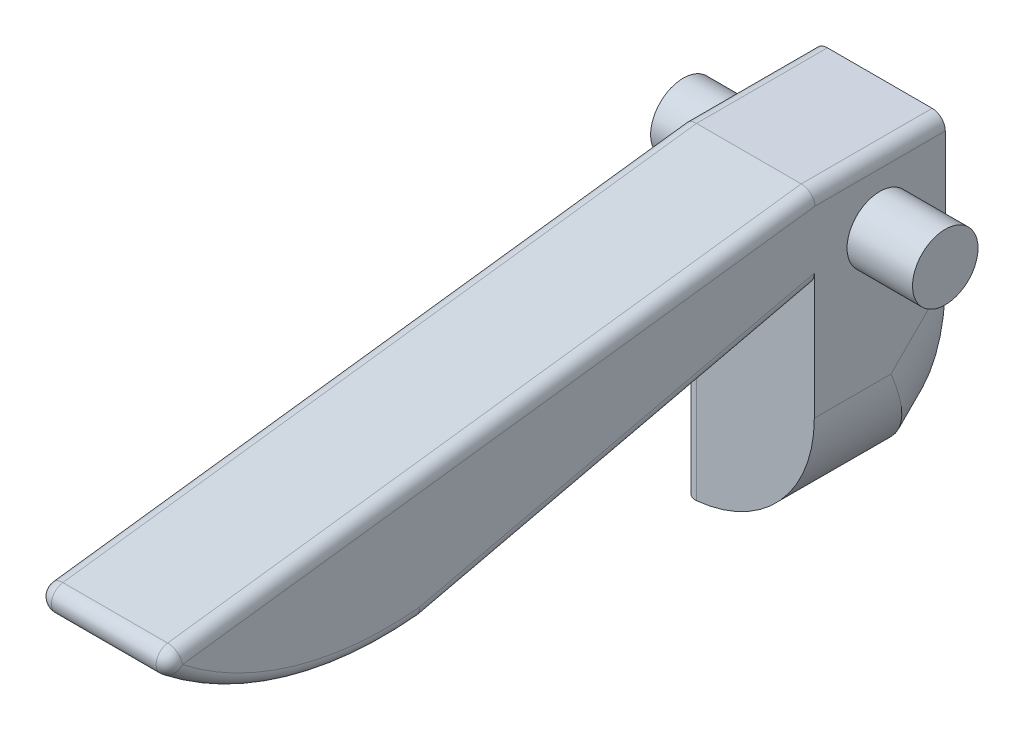
ISO-10303-21;
HEADER;
FILE_DESCRIPTION(('STEP AP214'),'2;1');
FILE_NAME('part.step','',(''),(''),'','','');
FILE_SCHEMA(('AUTOMOTIVE_DESIGN { 1 0 10303 214 1 1 1 1 }'));
ENDSEC;
DATA;
#1=APPLICATION_CONTEXT('core data for automotive mechanical design processes');
#2=APPLICATION_PROTOCOL_DEFINITION('international standard','automotive_design',2000,#1);
#3=PRODUCT_CONTEXT('',#1,'mechanical');
#4=PRODUCT('Part','Part','',(#3));
#5=PRODUCT_RELATED_PRODUCT_CATEGORY('part','',(#4));
#6=PRODUCT_DEFINITION_FORMATION('','',#4);
#7=PRODUCT_DEFINITION_CONTEXT('part definition',#1,'design');
#8=PRODUCT_DEFINITION('design','',#6,#7);
#9=PRODUCT_DEFINITION_SHAPE('','',#8);
#10=(LENGTH_UNIT() NAMED_UNIT(*) SI_UNIT(.MILLI.,.METRE.));
#11=(NAMED_UNIT(*) PLANE_ANGLE_UNIT() SI_UNIT($,.RADIAN.));
#12=(NAMED_UNIT(*) SI_UNIT($,.STERADIAN.) SOLID_ANGLE_UNIT());
#13=UNCERTAINTY_MEASURE_WITH_UNIT(LENGTH_MEASURE(1.E-05),#10,'distance_accuracy_value','');
#14=(GEOMETRIC_REPRESENTATION_CONTEXT(3) GLOBAL_UNCERTAINTY_ASSIGNED_CONTEXT((#13)) GLOBAL_UNIT_ASSIGNED_CONTEXT((#10,
#11,#12)) REPRESENTATION_CONTEXT('',''));
#15=CARTESIAN_POINT('',(0.,0.,0.));
#16=DIRECTION('',(0.,0.,1.));
#17=DIRECTION('',(1.,0.,0.));
#18=AXIS2_PLACEMENT_3D('',#15,#16,#17);
#19=CARTESIAN_POINT('',(1.,-32.0973049570919,30.3557385964642));
#20=DIRECTION('',(0.,-0.126546424947746,0.991960685880718));
#21=DIRECTION('',(0.,-0.991960685880718,-0.126546424947746));
#22=AXIS2_PLACEMENT_3D('',#19,#20,#21);
#23=CYLINDRICAL_SURFACE('',#22,1.);
#24=CARTESIAN_POINT('',(1.,-28.2166577046936,-0.063528575561073));
#25=DIRECTION('',(0.,-0.0634007654499612,0.997988147695332));
#26=DIRECTION('',(0.,0.997988147695332,0.0634007654499608));
#27=AXIS2_PLACEMENT_3D('',#24,#25,#26);
#28=ELLIPSE('',#27,1.00201590801385,1.);
#29=CARTESIAN_POINT('',(0.,-28.2166577046936,-0.0635285755611146));
#30=VERTEX_POINT('',#29);
#31=CARTESIAN_POINT('',(0.999999999999999,-27.2166577046936,0.));
#32=VERTEX_POINT('',#31);
#33=EDGE_CURVE('E11',#30,#32,#28,.F.);
#34=ORIENTED_EDGE('',*,*,#33,.F.);
#35=DIRECTION('',(0.,0.126546424947746,-0.991960685880718));
#36=VECTOR('',#35,1.);
#37=CARTESIAN_POINT('',(0.,-32.0973049570919,30.3557385964642));
#38=LINE('',#37,#36);
#39=CARTESIAN_POINT('',(0.,-34.3809483394538,48.2565560775588));
#40=VERTEX_POINT('',#39);
#41=EDGE_CURVE('E593',#40,#30,#38,.T.);
#42=ORIENTED_EDGE('',*,*,#41,.F.);
#43=CARTESIAN_POINT('',(1.,-34.3809483394538,48.2565560775588));
#44=DIRECTION('',(0.,0.126546424947743,-0.991960685880718));
#45=DIRECTION('',(0.,0.991960685880719,0.126546424947743));
#46=AXIS2_PLACEMENT_3D('',#43,#44,#45);
#47=CIRCLE('',#46,1.);
#48=CARTESIAN_POINT('',(1.,-33.3889876535731,48.3831025025065));
#49=VERTEX_POINT('',#48);
#50=EDGE_CURVE('E42',#40,#49,#47,.T.);
#51=ORIENTED_EDGE('',*,*,#50,.T.);
#52=DIRECTION('',(0.,0.126546424947746,-0.991960685880718));
#53=VECTOR('',#52,1.);
#54=CARTESIAN_POINT('',(1.,-31.1053442712112,30.482285021412));
#55=LINE('',#54,#53);
#56=EDGE_CURVE('E584',#32,#49,#55,.F.);
#57=ORIENTED_EDGE('',*,*,#56,.F.);
#58=EDGE_LOOP('',(#34,#42,#51,#57));
#59=FACE_BOUND('',#58,.T.);
#60=ADVANCED_FACE('F34',(#59),#23,.T.);
#61=CARTESIAN_POINT('',(0.999999999999999,-34.3809483394538,48.2565560775588));
#62=DIRECTION('',(0.,-0.991960685880718,-0.126546424947746));
#63=DIRECTION('',(0.,0.126546424947746,-0.991960685880718));
#64=AXIS2_PLACEMENT_3D('',#61,#62,#63);
#65=SPHERICAL_SURFACE('',#64,1.);
#66=ORIENTED_EDGE('',*,*,#50,.F.);
#67=CARTESIAN_POINT('',(0.999999999999999,-34.3809483394538,48.2565560775588));
#68=DIRECTION('',(0.,0.614872908270773,0.788626214803085));
#69=DIRECTION('',(0.,-0.788626214803085,0.614872908270773));
#70=AXIS2_PLACEMENT_3D('',#67,#68,#69);
#71=CIRCLE('',#70,1.);
#72=CARTESIAN_POINT('',(0.999999999999999,-35.1695745542569,48.8714289858296));
#73=VERTEX_POINT('',#72);
#74=EDGE_CURVE('E557',#73,#40,#71,.F.);
#75=ORIENTED_EDGE('',*,*,#74,.F.);
#76=CARTESIAN_POINT('',(0.999999999999999,-34.3809483394538,48.2565560775588));
#77=DIRECTION('',(-1.,0.,0.));
#78=DIRECTION('',(0.,0.,1.));
#79=AXIS2_PLACEMENT_3D('',#76,#77,#78);
#80=CIRCLE('',#79,1.);
#81=EDGE_CURVE('E609',#73,#49,#80,.T.);
#82=ORIENTED_EDGE('',*,*,#81,.T.);
#83=EDGE_LOOP('',(#66,#75,#82));
#84=FACE_BOUND('',#83,.T.);
#85=ADVANCED_FACE('F278',(#84),#65,.T.);
#86=CARTESIAN_POINT('',(10.,-34.3809483394538,48.2565560775588));
#87=DIRECTION('',(-1.,0.,0.));
#88=DIRECTION('',(0.,0.,1.));
#89=AXIS2_PLACEMENT_3D('',#86,#87,#88);
#90=CYLINDRICAL_SURFACE('',#89,1.);
#91=ORIENTED_EDGE('',*,*,#81,.F.);
#92=DIRECTION('',(-1.,0.,0.));
#93=VECTOR('',#92,1.);
#94=CARTESIAN_POINT('',(10.,-35.1695745542569,48.8714289858296));
#95=LINE('',#94,#93);
#96=CARTESIAN_POINT('',(9.,-35.1695745542569,48.8714289858296));
#97=VERTEX_POINT('',#96);
#98=EDGE_CURVE('E563',#97,#73,#95,.T.);
#99=ORIENTED_EDGE('',*,*,#98,.F.);
#100=CARTESIAN_POINT('',(9.,-34.3809483394538,48.2565560775588));
#101=DIRECTION('',(-1.,0.,0.));
#102=DIRECTION('',(0.,0.,1.));
#103=AXIS2_PLACEMENT_3D('',#100,#101,#102);
#104=CIRCLE('',#103,1.);
#105=CARTESIAN_POINT('',(9.,-33.3889876535731,48.3831025025065));
#106=VERTEX_POINT('',#105);
#107=EDGE_CURVE('E607',#97,#106,#104,.T.);
#108=ORIENTED_EDGE('',*,*,#107,.T.);
#109=DIRECTION('',(-1.,0.,0.));
#110=VECTOR('',#109,1.);
#111=CARTESIAN_POINT('',(10.,-33.3889876535731,48.3831025025065));
#112=LINE('',#111,#110);
#113=EDGE_CURVE('E587',#49,#106,#112,.F.);
#114=ORIENTED_EDGE('',*,*,#113,.F.);
#115=EDGE_LOOP('',(#91,#99,#108,#114));
#116=FACE_BOUND('',#115,.T.);
#117=ADVANCED_FACE('F274',(#116),#90,.T.);
#118=CARTESIAN_POINT('',(9.,-34.3809483394538,48.2565560775588));
#119=DIRECTION('',(0.,0.788626214803085,-0.614872908270773));
#120=DIRECTION('',(0.,0.614872908270773,0.788626214803085));
#121=AXIS2_PLACEMENT_3D('',#118,#119,#120);
#122=SPHERICAL_SURFACE('',#121,1.);
#123=ORIENTED_EDGE('',*,*,#107,.F.);
#124=CARTESIAN_POINT('',(9.,-34.3809483394538,48.2565560775588));
#125=DIRECTION('',(0.,0.614872908270773,0.788626214803085));
#126=DIRECTION('',(0.,-0.788626214803085,0.614872908270773));
#127=AXIS2_PLACEMENT_3D('',#124,#125,#126);
#128=CIRCLE('',#127,1.);
#129=CARTESIAN_POINT('',(10.,-34.3809483394538,48.2565560775588));
#130=VERTEX_POINT('',#129);
#131=EDGE_CURVE('E605',#97,#130,#128,.T.);
#132=ORIENTED_EDGE('',*,*,#131,.T.);
#133=CARTESIAN_POINT('',(9.,-34.3809483394538,48.2565560775588));
#134=DIRECTION('',(0.,-0.126546424947746,0.991960685880718));
#135=DIRECTION('',(0.,-0.991960685880718,-0.126546424947746));
#136=AXIS2_PLACEMENT_3D('',#133,#134,#135);
#137=CIRCLE('',#136,1.);
#138=EDGE_CURVE('E581',#106,#130,#137,.F.);
#139=ORIENTED_EDGE('',*,*,#138,.F.);
#140=EDGE_LOOP('',(#123,#132,#139));
#141=FACE_BOUND('',#140,.T.);
#142=ADVANCED_FACE('F270',(#141),#122,.T.);
#143=CARTESIAN_POINT('',(9.,-14.328937464659,32.6224850666923));
#144=DIRECTION('',(-1.,0.,0.));
#145=DIRECTION('',(0.,0.,1.));
#146=AXIS2_PLACEMENT_3D('',#143,#144,#145);
#147=TOROIDAL_SURFACE('',#146,25.426508145943,1.);
#148=ORIENTED_EDGE('',*,*,#131,.F.);
#149=CARTESIAN_POINT('',(9.,-14.328937464659,32.6224850666923));
#150=DIRECTION('',(-1.,0.,0.));
#151=DIRECTION('',(0.,0.,1.));
#152=AXIS2_PLACEMENT_3D('',#149,#150,#151);
#153=CIRCLE('',#152,26.426508145943);
#154=CARTESIAN_POINT('',(9.,-40.6315231932399,30.0662540954687));
#155=VERTEX_POINT('',#154);
#156=EDGE_CURVE('E566',#155,#97,#153,.T.);
#157=ORIENTED_EDGE('',*,*,#156,.F.);
#158=CARTESIAN_POINT('',(9.,-39.6362125156686,30.1629839001446));
#159=DIRECTION('',(0.,-0.0967298046759203,0.995310677571259));
#160=DIRECTION('',(0.,-0.995310677571259,-0.0967298046759203));
#161=AXIS2_PLACEMENT_3D('',#158,#159,#160);
#162=CIRCLE('',#161,1.);
#163=CARTESIAN_POINT('',(10.,-39.6362125156686,30.1629839001446));
#164=VERTEX_POINT('',#163);
#165=EDGE_CURVE('E603',#155,#164,#162,.T.);
#166=ORIENTED_EDGE('',*,*,#165,.T.);
#167=CARTESIAN_POINT('',(10.,-14.328937464659,32.6224850666923));
#168=DIRECTION('',(-1.,0.,0.));
#169=DIRECTION('',(0.,0.,1.));
#170=AXIS2_PLACEMENT_3D('',#167,#168,#169);
#171=CIRCLE('',#170,25.426508145943);
#172=EDGE_CURVE('E578',#130,#164,#171,.F.);
#173=ORIENTED_EDGE('',*,*,#172,.F.);
#174=EDGE_LOOP('',(#148,#157,#166,#173));
#175=FACE_BOUND('',#174,.T.);
#176=ADVANCED_FACE('F266',(#175),#147,.T.);
#177=CARTESIAN_POINT('',(9.,-39.6362125156686,30.1629839001446));
#178=DIRECTION('',(0.,0.995310677571259,0.0967298046759188));
#179=DIRECTION('',(0.,-0.0967298046759188,0.995310677571259));
#180=AXIS2_PLACEMENT_3D('',#177,#178,#179);
#181=SPHERICAL_SURFACE('',#180,1.);
#182=ORIENTED_EDGE('',*,*,#165,.F.);
#183=CARTESIAN_POINT('',(9.,-39.6362125156686,30.1629839001446));
#184=DIRECTION('',(1.,0.,0.));
#185=DIRECTION('',(0.,0.,-1.));
#186=AXIS2_PLACEMENT_3D('',#183,#184,#185);
#187=CIRCLE('',#186,1.);
#188=CARTESIAN_POINT('',(9.,-40.6102031878127,29.9363957923889));
#189=VERTEX_POINT('',#188);
#190=EDGE_CURVE('E601',#155,#189,#187,.T.);
#191=ORIENTED_EDGE('',*,*,#190,.T.);
#192=CARTESIAN_POINT('',(9.,-39.6362125156686,30.1629839001446));
#193=DIRECTION('',(0.,-0.22658810775574,0.973990672144078));
#194=DIRECTION('',(0.,-0.973990672144078,-0.22658810775574));
#195=AXIS2_PLACEMENT_3D('',#192,#193,#194);
#196=CIRCLE('',#195,1.);
#197=EDGE_CURVE('E575',#164,#189,#196,.F.);
#198=ORIENTED_EDGE('',*,*,#197,.F.);
#199=EDGE_LOOP('',(#182,#191,#198));
#200=FACE_BOUND('',#199,.T.);
#201=ADVANCED_FACE('F262',(#200),#181,.T.);
#202=CARTESIAN_POINT('',(10.,-39.6362125156686,30.1629839001445));
#203=DIRECTION('',(-1.,0.,0.));
#204=DIRECTION('',(0.,0.,1.));
#205=AXIS2_PLACEMENT_3D('',#202,#203,#204);
#206=CYLINDRICAL_SURFACE('',#205,1.);
#207=ORIENTED_EDGE('',*,*,#190,.F.);
#208=DIRECTION('',(-1.,0.,0.));
#209=VECTOR('',#208,1.);
#210=CARTESIAN_POINT('',(10.,-40.6315231932399,30.0662540954686));
#211=LINE('',#210,#209);
#212=CARTESIAN_POINT('',(0.999999999999999,-40.6315231932399,30.0662540954687));
#213=VERTEX_POINT('',#212);
#214=EDGE_CURVE('E569',#213,#155,#211,.F.);
#215=ORIENTED_EDGE('',*,*,#214,.F.);
#216=CARTESIAN_POINT('',(1.,-39.6362125156686,30.1629839001446));
#217=DIRECTION('',(1.,0.,0.));
#218=DIRECTION('',(0.,0.,-1.));
#219=AXIS2_PLACEMENT_3D('',#216,#217,#218);
#220=CIRCLE('',#219,1.);
#221=CARTESIAN_POINT('',(1.,-40.6102031878127,29.9363957923888));
#222=VERTEX_POINT('',#221);
#223=EDGE_CURVE('E599',#213,#222,#220,.T.);
#224=ORIENTED_EDGE('',*,*,#223,.T.);
#225=DIRECTION('',(-1.,0.,0.));
#226=VECTOR('',#225,1.);
#227=CARTESIAN_POINT('',(10.,-40.6102031878127,29.9363957923888));
#228=LINE('',#227,#226);
#229=EDGE_CURVE('E572',#189,#222,#228,.T.);
#230=ORIENTED_EDGE('',*,*,#229,.F.);
#231=EDGE_LOOP('',(#207,#215,#224,#230));
#232=FACE_BOUND('',#231,.T.);
#233=ADVANCED_FACE('F258',(#232),#206,.T.);
#234=CARTESIAN_POINT('',(1.,-39.6362125156686,30.1629839001446));
#235=DIRECTION('',(0.,0.995310677571259,0.0967298046759183));
#236=DIRECTION('',(0.,-0.0967298046759183,0.995310677571259));
#237=AXIS2_PLACEMENT_3D('',#234,#235,#236);
#238=SPHERICAL_SURFACE('',#237,1.);
#239=ORIENTED_EDGE('',*,*,#223,.F.);
#240=CARTESIAN_POINT('',(1.,-39.6362125156686,30.1629839001446));
#241=DIRECTION('',(0.,0.0967298046759183,-0.995310677571259));
#242=DIRECTION('',(0.,0.995310677571259,0.0967298046759183));
#243=AXIS2_PLACEMENT_3D('',#240,#241,#242);
#244=CIRCLE('',#243,1.);
#245=CARTESIAN_POINT('',(0.,-39.6362125156686,30.1629839001446));
#246=VERTEX_POINT('',#245);
#247=EDGE_CURVE('E560',#246,#213,#244,.F.);
#248=ORIENTED_EDGE('',*,*,#247,.F.);
#249=CARTESIAN_POINT('',(1.,-39.6362125156686,30.1629839001446));
#250=DIRECTION('',(0.,0.22658810775574,-0.973990672144078));
#251=DIRECTION('',(0.,0.973990672144078,0.22658810775574));
#252=AXIS2_PLACEMENT_3D('',#249,#250,#251);
#253=CIRCLE('',#252,1.);
#254=EDGE_CURVE('E554',#222,#246,#253,.T.);
#255=ORIENTED_EDGE('',*,*,#254,.F.);
#256=EDGE_LOOP('',(#239,#248,#255));
#257=FACE_BOUND('',#256,.T.);
#258=ADVANCED_FACE('F255',(#257),#238,.T.);
#259=CARTESIAN_POINT('',(1.,-28.2166577046936,32.6224850666923));
#260=DIRECTION('',(0.,0.,1.));
#261=DIRECTION('',(1.,0.,0.));
#262=AXIS2_PLACEMENT_3D('',#259,#260,#261);
#263=CYLINDRICAL_SURFACE('',#262,1.);
#264=DIRECTION('',(0.,0.,-1.));
#265=VECTOR('',#264,1.);
#266=CARTESIAN_POINT('',(0.,-28.2166577046936,32.6224850666923));
#267=LINE('',#266,#265);
#268=CARTESIAN_POINT('',(0.,-28.2166577046936,-10.));
#269=VERTEX_POINT('',#268);
#270=EDGE_CURVE('E590',#30,#269,#267,.T.);
#271=ORIENTED_EDGE('',*,*,#270,.F.);
#272=ORIENTED_EDGE('',*,*,#33,.T.);
#273=DIRECTION('',(0.,0.,-1.));
#274=VECTOR('',#273,1.);
#275=CARTESIAN_POINT('',(1.,-27.2166577046936,32.6224850666923));
#276=LINE('',#275,#274);
#277=CARTESIAN_POINT('',(0.999999999999999,-27.2166577046936,-10.));
#278=VERTEX_POINT('',#277);
#279=EDGE_CURVE('E595',#278,#32,#276,.F.);
#280=ORIENTED_EDGE('',*,*,#279,.F.);
#281=CARTESIAN_POINT('',(1.,-28.2166577046936,-10.));
#282=DIRECTION('',(0.,0.,1.));
#283=DIRECTION('',(0.,-1.,0.));
#284=AXIS2_PLACEMENT_3D('',#281,#282,#283);
#285=CIRCLE('',#284,1.);
#286=EDGE_CURVE('E49',#269,#278,#285,.F.);
#287=ORIENTED_EDGE('',*,*,#286,.F.);
#288=EDGE_LOOP('',(#271,#272,#280,#287));
#289=FACE_BOUND('',#288,.T.);
#290=ADVANCED_FACE('F36',(#289),#263,.T.);
#291=CARTESIAN_POINT('',(9.,-28.2166577046936,32.6224850666923));
#292=DIRECTION('',(0.,0.,1.));
#293=DIRECTION('',(1.,0.,0.));
#294=AXIS2_PLACEMENT_3D('',#291,#292,#293);
#295=CYLINDRICAL_SURFACE('',#294,1.);
#296=CARTESIAN_POINT('',(9.,-28.2166577046936,-0.0635285755610972));
#297=DIRECTION('',(0.,-0.0634007654499612,0.997988147695332));
#298=DIRECTION('',(0.,-0.997988147695332,-0.0634007654499608));
#299=AXIS2_PLACEMENT_3D('',#296,#297,#298);
#300=ELLIPSE('',#299,1.00201590801385,1.);
#301=CARTESIAN_POINT('',(10.,-28.2166577046936,-0.0635285755611146));
#302=VERTEX_POINT('',#301);
#303=CARTESIAN_POINT('',(9.,-27.2166577046936,0.));
#304=VERTEX_POINT('',#303);
#305=EDGE_CURVE('E544',#302,#304,#300,.T.);
#306=ORIENTED_EDGE('',*,*,#305,.F.);
#307=DIRECTION('',(0.,0.,1.));
#308=VECTOR('',#307,1.);
#309=CARTESIAN_POINT('',(10.,-28.2166577046936,32.6224850666923));
#310=LINE('',#309,#308);
#311=CARTESIAN_POINT('',(10.,-28.2166577046936,-10.));
#312=VERTEX_POINT('',#311);
#313=EDGE_CURVE('E534',#312,#302,#310,.T.);
#314=ORIENTED_EDGE('',*,*,#313,.F.);
#315=CARTESIAN_POINT('',(9.,-28.2166577046936,-10.));
#316=DIRECTION('',(0.,0.,1.));
#317=DIRECTION('',(0.,-1.,0.));
#318=AXIS2_PLACEMENT_3D('',#315,#316,#317);
#319=CIRCLE('',#318,1.);
#320=CARTESIAN_POINT('',(9.,-27.2166577046936,-10.));
#321=VERTEX_POINT('',#320);
#322=EDGE_CURVE('E537',#321,#312,#319,.F.);
#323=ORIENTED_EDGE('',*,*,#322,.F.);
#324=DIRECTION('',(0.,0.,1.));
#325=VECTOR('',#324,1.);
#326=CARTESIAN_POINT('',(9.,-27.2166577046936,0.));
#327=LINE('',#326,#325);
#328=EDGE_CURVE('E541',#304,#321,#327,.F.);
#329=ORIENTED_EDGE('',*,*,#328,.F.);
#330=EDGE_LOOP('',(#306,#314,#323,#329));
#331=FACE_BOUND('',#330,.T.);
#332=ADVANCED_FACE('F250',(#331),#295,.T.);
#333=CARTESIAN_POINT('',(9.,-32.0973049570919,30.3557385964642));
#334=DIRECTION('',(0.,-0.126546424947746,0.991960685880718));
#335=DIRECTION('',(0.,-0.991960685880718,-0.126546424947746));
#336=AXIS2_PLACEMENT_3D('',#333,#334,#335);
#337=CYLINDRICAL_SURFACE('',#336,1.);
#338=DIRECTION('',(0.,-0.126546424947746,0.991960685880718));
#339=VECTOR('',#338,1.);
#340=CARTESIAN_POINT('',(9.,-33.674991038027,50.625));
#341=LINE('',#340,#339);
#342=EDGE_CURVE('E540',#106,#304,#341,.F.);
#343=ORIENTED_EDGE('',*,*,#342,.F.);
#344=ORIENTED_EDGE('',*,*,#138,.T.);
#345=DIRECTION('',(0.,-0.126546424947746,0.991960685880718));
#346=VECTOR('',#345,1.);
#347=CARTESIAN_POINT('',(10.,-32.0973049570919,30.3557385964642));
#348=LINE('',#347,#346);
#349=EDGE_CURVE('E545',#302,#130,#348,.T.);
#350=ORIENTED_EDGE('',*,*,#349,.F.);
#351=ORIENTED_EDGE('',*,*,#305,.T.);
#352=EDGE_LOOP('',(#343,#344,#350,#351));
#353=FACE_BOUND('',#352,.T.);
#354=ADVANCED_FACE('F246',(#353),#337,.T.);
#355=CARTESIAN_POINT('',(1.,-38.8796809635741,26.9110273777086));
#356=DIRECTION('',(0.,0.22658810775574,-0.973990672144078));
#357=DIRECTION('',(0.,0.973990672144078,0.22658810775574));
#358=AXIS2_PLACEMENT_3D('',#355,#356,#357);
#359=CYLINDRICAL_SURFACE('',#358,1.);
#360=DIRECTION('',(0.,-0.22658810775574,0.973990672144078));
#361=VECTOR('',#360,1.);
#362=CARTESIAN_POINT('',(1.,-39.8536716357182,26.6844392699528));
#363=LINE('',#362,#361);
#364=CARTESIAN_POINT('',(0.999999999999999,-33.6458333333333,0.));
#365=VERTEX_POINT('',#364);
#366=EDGE_CURVE('E623',#222,#365,#363,.F.);
#367=ORIENTED_EDGE('',*,*,#366,.F.);
#368=ORIENTED_EDGE('',*,*,#254,.T.);
#369=DIRECTION('',(0.,-0.22658810775574,0.973990672144078));
#370=VECTOR('',#369,1.);
#371=CARTESIAN_POINT('',(0.,-38.8796809635741,26.9110273777086));
#372=LINE('',#371,#370);
#373=CARTESIAN_POINT('',(0.,-32.3864905666766,-0.999999999999996));
#374=VERTEX_POINT('',#373);
#375=EDGE_CURVE('E622',#374,#246,#372,.T.);
#376=ORIENTED_EDGE('',*,*,#375,.F.);
#377=CARTESIAN_POINT('',(1.,-32.3864905666766,-0.999999999999996));
#378=DIRECTION('',(0.,-0.621856853401271,-0.783130930226785));
#379=DIRECTION('',(0.,0.783130930226785,-0.621856853401271));
#380=AXIS2_PLACEMENT_3D('',#377,#378,#379);
#381=ELLIPSE('',#380,1.6080871257275,1.);
#382=EDGE_CURVE('E548',#374,#365,#381,.F.);
#383=ORIENTED_EDGE('',*,*,#382,.T.);
#384=EDGE_LOOP('',(#367,#368,#376,#383));
#385=FACE_BOUND('',#384,.T.);
#386=ADVANCED_FACE('F242',(#385),#359,.T.);
#387=CARTESIAN_POINT('',(0.999999999999999,-14.328937464659,32.6224850666923));
#388=DIRECTION('',(-1.,0.,0.));
#389=DIRECTION('',(0.,0.,1.));
#390=AXIS2_PLACEMENT_3D('',#387,#388,#389);
#391=TOROIDAL_SURFACE('',#390,25.426508145943,1.);
#392=CARTESIAN_POINT('',(0.,-14.328937464659,32.6224850666923));
#393=DIRECTION('',(-1.,0.,0.));
#394=DIRECTION('',(0.,0.,1.));
#395=AXIS2_PLACEMENT_3D('',#392,#393,#394);
#396=CIRCLE('',#395,25.426508145943);
#397=EDGE_CURVE('E227',#246,#40,#396,.T.);
#398=ORIENTED_EDGE('',*,*,#397,.F.);
#399=ORIENTED_EDGE('',*,*,#247,.T.);
#400=CARTESIAN_POINT('',(0.999999999999999,-14.328937464659,32.6224850666923));
#401=DIRECTION('',(-1.,0.,0.));
#402=DIRECTION('',(0.,0.,1.));
#403=AXIS2_PLACEMENT_3D('',#400,#401,#402);
#404=CIRCLE('',#403,26.426508145943);
#405=EDGE_CURVE('E624',#73,#213,#404,.F.);
#406=ORIENTED_EDGE('',*,*,#405,.F.);
#407=ORIENTED_EDGE('',*,*,#74,.T.);
#408=EDGE_LOOP('',(#398,#399,#406,#407));
#409=FACE_BOUND('',#408,.T.);
#410=ADVANCED_FACE('F238',(#409),#391,.T.);
#411=CARTESIAN_POINT('',(1.,-14.328937464659,-0.999999999999994));
#412=DIRECTION('',(0.,-1.,0.));
#413=DIRECTION('',(0.,0.,-1.));
#414=AXIS2_PLACEMENT_3D('',#411,#412,#413);
#415=CYLINDRICAL_SURFACE('',#414,1.);
#416=DIRECTION('',(0.,1.,0.));
#417=VECTOR('',#416,1.);
#418=CARTESIAN_POINT('',(0.,-14.328937464659,-0.999999999999994));
#419=LINE('',#418,#417);
#420=CARTESIAN_POINT('',(0.,-52.2166577046936,-1.));
#421=VERTEX_POINT('',#420);
#422=EDGE_CURVE('E216',#421,#374,#419,.T.);
#423=ORIENTED_EDGE('',*,*,#422,.F.);
#424=CARTESIAN_POINT('',(1.,-52.1665320757598,0.));
#425=CARTESIAN_POINT('',(0.972019765312954,-52.1693448501758,-1.81046888584766E-07));
#426=CARTESIAN_POINT('',(0.944040499445657,-52.1720368458211,-0.00117511126615066));
#427=CARTESIAN_POINT('',(0.888256491872375,-52.1771688960537,-0.00586836616370874));
#428=CARTESIAN_POINT('',(0.860451747482707,-52.1796089545241,-0.00938665471772507));
#429=CARTESIAN_POINT('',(0.777644390470128,-52.1865284608046,-0.0234326114814874));
#430=CARTESIAN_POINT('',(0.723158942384326,-52.1906162126853,-0.0374514216411297));
#431=CARTESIAN_POINT('',(0.61723722821835,-52.1977320986516,-0.0744482645463401));
#432=CARTESIAN_POINT('',(0.565802932349418,-52.2007595541306,-0.097432015181837));
#433=CARTESIAN_POINT('',(0.467484831956479,-52.2058459301665,-0.151720345983614));
#434=CARTESIAN_POINT('',(0.420599996705338,-52.2079050705138,-0.183023035371777));
#435=CARTESIAN_POINT('',(0.332847399574372,-52.2112132251714,-0.252973568563804));
#436=CARTESIAN_POINT('',(0.291964183830473,-52.2124643493964,-0.291601938917953));
#437=CARTESIAN_POINT('',(0.217225385878448,-52.214368158895,-0.375174801155017));
#438=CARTESIAN_POINT('',(0.183371317738336,-52.2150207153413,-0.420120650324511));
#439=CARTESIAN_POINT('',(0.123625973662146,-52.215938372085,-0.515106210620492));
#440=CARTESIAN_POINT('',(0.097745278276629,-52.2162029592871,-0.565152573928337));
#441=CARTESIAN_POINT('',(0.0547503111164115,-52.216531070267,-0.66886605752099));
#442=CARTESIAN_POINT('',(0.0376311202794657,-52.2165947069705,-0.722531126920404));
#443=CARTESIAN_POINT('',(0.0167808451927883,-52.2166471145762,-0.813754346548588));
#444=CARTESIAN_POINT('',(0.0104922289262866,-52.2166537206099,-0.850748418381025));
#445=CARTESIAN_POINT('',(0.00210207061949181,-52.2166577261607,-0.92515655953862));
#446=CARTESIAN_POINT('',(-5.23188419343068E-06,-52.2166551383577,-0.962569979532249));
#447=CARTESIAN_POINT('',(0.,-52.2166577046936,-1.));
#448=B_SPLINE_CURVE_WITH_KNOTS('',3,(#424,#425,#426,#427,#428,#429,#430,#431,#432,#433,#434,
#435,#436,#437,#438,#439,#440,#441,#442,#443,#444,#445,#446,#447),.UNSPECIFIED.,.F.,.F.,(4,2,2,
2,2,2,2,2,2,2,2,4),(0.,0.084312820250299,0.16862434079779,0.336980334772971,0.505443883202118,
0.673869174927181,0.841852872303374,1.00987271566854,1.17811456802734,1.34626185871338,
1.45861529104377,1.57081382984397),.UNSPECIFIED.);
#449=CARTESIAN_POINT('',(1.,-52.1665320757598,0.));
#450=VERTEX_POINT('',#449);
#451=EDGE_CURVE('E156',#450,#421,#448,.T.);
#452=ORIENTED_EDGE('',*,*,#451,.F.);
#453=DIRECTION('',(0.,1.,0.));
#454=VECTOR('',#453,1.);
#455=CARTESIAN_POINT('',(1.,-14.328937464659,0.));
#456=LINE('',#455,#454);
#457=EDGE_CURVE('E218',#365,#450,#456,.F.);
#458=ORIENTED_EDGE('',*,*,#457,.F.);
#459=ORIENTED_EDGE('',*,*,#382,.F.);
#460=EDGE_LOOP('',(#423,#452,#458,#459));
#461=FACE_BOUND('',#460,.T.);
#462=ADVANCED_FACE('F232',(#461),#415,.T.);
#463=CARTESIAN_POINT('',(9.,-32.6718426611893,0.226588107755743));
#464=DIRECTION('',(0.,-0.22658810775574,0.973990672144078));
#465=DIRECTION('',(0.,-0.973990672144078,-0.22658810775574));
#466=AXIS2_PLACEMENT_3D('',#463,#464,#465);
#467=CYLINDRICAL_SURFACE('',#466,1.);
#468=DIRECTION('',(0.,-0.22658810775574,0.973990672144078));
#469=VECTOR('',#468,1.);
#470=CARTESIAN_POINT('',(10.,-38.8796809635741,26.9110273777086));
#471=LINE('',#470,#469);
#472=CARTESIAN_POINT('',(10.,-32.6191294555655,0.));
#473=VERTEX_POINT('',#472);
#474=EDGE_CURVE('E211',#164,#473,#471,.F.);
#475=ORIENTED_EDGE('',*,*,#474,.F.);
#476=ORIENTED_EDGE('',*,*,#197,.T.);
#477=DIRECTION('',(0.,-0.22658810775574,0.973990672144078));
#478=VECTOR('',#477,1.);
#479=CARTESIAN_POINT('',(9.,-33.6458333333333,0.));
#480=LINE('',#479,#478);
#481=CARTESIAN_POINT('',(9.,-33.6458333333333,0.));
#482=VERTEX_POINT('',#481);
#483=EDGE_CURVE('E170',#482,#189,#480,.T.);
#484=ORIENTED_EDGE('',*,*,#483,.F.);
#485=CARTESIAN_POINT('',(9.,-32.6191294555655,0.));
#486=DIRECTION('',(0.,0.,-1.));
#487=DIRECTION('',(0.,-1.,0.));
#488=AXIS2_PLACEMENT_3D('',#485,#486,#487);
#489=ELLIPSE('',#488,1.02670387776781,1.);
#490=EDGE_CURVE('E213',#482,#473,#489,.F.);
#491=ORIENTED_EDGE('',*,*,#490,.T.);
#492=EDGE_LOOP('',(#475,#476,#484,#491));
#493=FACE_BOUND('',#492,.T.);
#494=ADVANCED_FACE('F237',(#493),#467,.T.);
#495=CARTESIAN_POINT('',(0.,-42.2166577046936,32.6224850666923));
#496=DIRECTION('',(0.,0.,-1.));
#497=DIRECTION('',(-1.,0.,0.));
#498=AXIS2_PLACEMENT_3D('',#495,#496,#497);
#499=CYLINDRICAL_SURFACE('',#498,10.);
#500=CARTESIAN_POINT('',(0.,-42.2166577046936,0.));
#501=DIRECTION('',(0.,0.,-1.));
#502=DIRECTION('',(0.,1.,0.));
#503=AXIS2_PLACEMENT_3D('',#500,#501,#502);
#504=CIRCLE('',#503,10.);
#505=CARTESIAN_POINT('',(10.,-42.2166577046936,0.));
#506=VERTEX_POINT('',#505);
#507=EDGE_CURVE('E203',#450,#506,#504,.F.);
#508=ORIENTED_EDGE('',*,*,#507,.F.);
#509=ORIENTED_EDGE('',*,*,#451,.T.);
#510=DIRECTION('',(0.,0.,-1.));
#511=VECTOR('',#510,1.);
#512=CARTESIAN_POINT('',(0.,-52.2166577046936,0.));
#513=LINE('',#512,#511);
#514=CARTESIAN_POINT('',(0.,-52.2166577046936,-10.));
#515=VERTEX_POINT('',#514);
#516=EDGE_CURVE('E149',#421,#515,#513,.T.);
#517=ORIENTED_EDGE('',*,*,#516,.T.);
#518=CARTESIAN_POINT('',(0.,-42.2166577046936,-5.85786437626906));
#519=DIRECTION('',(0.,0.38268343236509,-0.923879532511287));
#520=DIRECTION('',(0.,0.923879532511287,0.38268343236509));
#521=AXIS2_PLACEMENT_3D('',#518,#519,#520);
#522=ELLIPSE('',#521,10.8239220029239,10.);
#523=CARTESIAN_POINT('',(10.,-42.2166577046936,-5.85786437626905));
#524=VERTEX_POINT('',#523);
#525=EDGE_CURVE('E154',#524,#515,#522,.T.);
#526=ORIENTED_EDGE('',*,*,#525,.F.);
#527=DIRECTION('',(0.,0.,-1.));
#528=VECTOR('',#527,1.);
#529=CARTESIAN_POINT('',(10.,-42.2166577046936,32.6224850666923));
#530=LINE('',#529,#528);
#531=EDGE_CURVE('E201',#506,#524,#530,.T.);
#532=ORIENTED_EDGE('',*,*,#531,.F.);
#533=EDGE_LOOP('',(#508,#509,#517,#526,#532));
#534=FACE_BOUND('',#533,.T.);
#535=ADVANCED_FACE('F152',(#534),#499,.T.);
#536=CARTESIAN_POINT('',(0.,-47.512972306157,-0.561549774805693));
#537=DIRECTION('',(0.,0.707106781186547,-0.707106781186548));
#538=DIRECTION('',(0.,0.707106781186548,0.707106781186547));
#539=AXIS2_PLACEMENT_3D('',#536,#537,#538);
#540=CYLINDRICAL_SURFACE('',#539,10.);
#541=DIRECTION('',(0.,0.707106781186547,-0.707106781186548));
#542=VECTOR('',#541,1.);
#543=CARTESIAN_POINT('',(10.,-47.512972306157,-0.561549774805693));
#544=LINE('',#543,#542);
#545=CARTESIAN_POINT('',(10.,-38.0745220809627,-10.));
#546=VERTEX_POINT('',#545);
#547=EDGE_CURVE('E169',#524,#546,#544,.T.);
#548=ORIENTED_EDGE('',*,*,#547,.F.);
#549=ORIENTED_EDGE('',*,*,#525,.T.);
#550=DIRECTION('',(0.,0.707106781186547,-0.707106781186548));
#551=VECTOR('',#550,1.);
#552=CARTESIAN_POINT('',(0.,-47.2166577046936,-15.));
#553=LINE('',#552,#551);
#554=CARTESIAN_POINT('',(0.,-47.2166577046936,-15.));
#555=VERTEX_POINT('',#554);
#556=EDGE_CURVE('E160',#515,#555,#553,.T.);
#557=ORIENTED_EDGE('',*,*,#556,.T.);
#558=CARTESIAN_POINT('',(0.,-47.2166577046936,-0.857864376269051));
#559=DIRECTION('',(0.,-1.,0.));
#560=DIRECTION('',(0.,0.,-1.));
#561=AXIS2_PLACEMENT_3D('',#558,#559,#560);
#562=ELLIPSE('',#561,14.142135623731,10.);
#563=CARTESIAN_POINT('',(7.62959226424681,-47.2166577046936,-10.));
#564=VERTEX_POINT('',#563);
#565=EDGE_CURVE('E171',#564,#555,#562,.F.);
#566=ORIENTED_EDGE('',*,*,#565,.F.);
#567=CARTESIAN_POINT('',(0.,-38.0745220809627,-10.));
#568=DIRECTION('',(0.,0.,1.));
#569=DIRECTION('',(0.,1.,0.));
#570=AXIS2_PLACEMENT_3D('',#567,#568,#569);
#571=ELLIPSE('',#570,14.1421356237309,10.);
#572=EDGE_CURVE('E205',#546,#564,#571,.F.);
#573=ORIENTED_EDGE('',*,*,#572,.F.);
#574=EDGE_LOOP('',(#548,#549,#557,#566,#573));
#575=FACE_BOUND('',#574,.T.);
#576=ADVANCED_FACE('F166',(#575),#540,.T.);
#577=CARTESIAN_POINT('',(10.,-33.674991038027,50.625));
#578=DIRECTION('',(0.,-0.991960685880718,-0.126546424947746));
#579=DIRECTION('',(0.,0.126546424947746,-0.991960685880718));
#580=AXIS2_PLACEMENT_3D('',#577,#578,#579);
#581=PLANE('',#580);
#582=ORIENTED_EDGE('',*,*,#56,.T.);
#583=ORIENTED_EDGE('',*,*,#113,.T.);
#584=ORIENTED_EDGE('',*,*,#342,.T.);
#585=DIRECTION('',(-1.,0.,0.));
#586=VECTOR('',#585,1.);
#587=CARTESIAN_POINT('',(10.,-27.2166577046936,0.));
#588=LINE('',#587,#586);
#589=EDGE_CURVE('E185',#304,#32,#588,.T.);
#590=ORIENTED_EDGE('',*,*,#589,.T.);
#591=EDGE_LOOP('',(#582,#583,#584,#590));
#592=FACE_BOUND('',#591,.T.);
#593=ADVANCED_FACE('F359',(#592),#581,.F.);
#594=CARTESIAN_POINT('',(10.,-14.328937464659,32.6224850666923));
#595=DIRECTION('',(-1.,0.,0.));
#596=DIRECTION('',(0.,0.,1.));
#597=AXIS2_PLACEMENT_3D('',#594,#595,#596);
#598=CYLINDRICAL_SURFACE('',#597,26.426508145943);
#599=ORIENTED_EDGE('',*,*,#405,.T.);
#600=ORIENTED_EDGE('',*,*,#214,.T.);
#601=ORIENTED_EDGE('',*,*,#156,.T.);
#602=ORIENTED_EDGE('',*,*,#98,.T.);
#603=EDGE_LOOP('',(#599,#600,#601,#602));
#604=FACE_BOUND('',#603,.T.);
#605=ADVANCED_FACE('F365',(#604),#598,.T.);
#606=CARTESIAN_POINT('',(10.,-33.6458333333333,0.));
#607=DIRECTION('',(0.,0.973990672144078,0.22658810775574));
#608=DIRECTION('',(0.,-0.22658810775574,0.973990672144078));
#609=AXIS2_PLACEMENT_3D('',#606,#607,#608);
#610=PLANE('',#609);
#611=ORIENTED_EDGE('',*,*,#483,.T.);
#612=ORIENTED_EDGE('',*,*,#229,.T.);
#613=ORIENTED_EDGE('',*,*,#366,.T.);
#614=DIRECTION('',(-1.,0.,0.));
#615=VECTOR('',#614,1.);
#616=CARTESIAN_POINT('',(10.,-33.6458333333333,0.));
#617=LINE('',#616,#615);
#618=EDGE_CURVE('E194',#482,#365,#617,.T.);
#619=ORIENTED_EDGE('',*,*,#618,.F.);
#620=EDGE_LOOP('',(#611,#612,#613,#619));
#621=FACE_BOUND('',#620,.T.);
#622=ADVANCED_FACE('F372',(#621),#610,.F.);
#623=CARTESIAN_POINT('',(10.,-33.6458333333333,0.));
#624=DIRECTION('',(0.,0.,-1.));
#625=DIRECTION('',(0.,1.,0.));
#626=AXIS2_PLACEMENT_3D('',#623,#624,#625);
#627=PLANE('',#626);
#628=ORIENTED_EDGE('',*,*,#618,.T.);
#629=ORIENTED_EDGE('',*,*,#457,.T.);
#630=ORIENTED_EDGE('',*,*,#507,.T.);
#631=DIRECTION('',(0.,-1.,0.));
#632=VECTOR('',#631,1.);
#633=CARTESIAN_POINT('',(10.,-33.6458333333333,0.));
#634=LINE('',#633,#632);
#635=EDGE_CURVE('E184',#473,#506,#634,.T.);
#636=ORIENTED_EDGE('',*,*,#635,.F.);
#637=ORIENTED_EDGE('',*,*,#490,.F.);
#638=EDGE_LOOP('',(#628,#629,#630,#636,#637));
#639=FACE_BOUND('',#638,.T.);
#640=ADVANCED_FACE('F380',(#639),#627,.F.);
#641=CARTESIAN_POINT('',(10.,-47.2166577046936,-10.));
#642=DIRECTION('',(0.,-1.,0.));
#643=DIRECTION('',(0.,0.,-1.));
#644=AXIS2_PLACEMENT_3D('',#641,#642,#643);
#645=PLANE('',#644);
#646=DIRECTION('',(-1.,0.,0.));
#647=VECTOR('',#646,1.);
#648=CARTESIAN_POINT('',(10.,-47.2166577046936,-10.));
#649=LINE('',#648,#647);
#650=CARTESIAN_POINT('',(0.,-47.2166577046936,-10.));
#651=VERTEX_POINT('',#650);
#652=EDGE_CURVE('E192',#564,#651,#649,.T.);
#653=ORIENTED_EDGE('',*,*,#652,.F.);
#654=ORIENTED_EDGE('',*,*,#565,.T.);
#655=DIRECTION('',(0.,0.,1.));
#656=VECTOR('',#655,1.);
#657=CARTESIAN_POINT('',(0.,-47.2166577046936,-10.));
#658=LINE('',#657,#656);
#659=EDGE_CURVE('E177',#555,#651,#658,.T.);
#660=ORIENTED_EDGE('',*,*,#659,.T.);
#661=EDGE_LOOP('',(#653,#654,#660));
#662=FACE_BOUND('',#661,.T.);
#663=ADVANCED_FACE('F388',(#662),#645,.F.);
#664=CARTESIAN_POINT('',(10.,-27.2166577046936,-10.));
#665=DIRECTION('',(0.,0.,1.));
#666=DIRECTION('',(0.,-1.,0.));
#667=AXIS2_PLACEMENT_3D('',#664,#665,#666);
#668=PLANE('',#667);
#669=DIRECTION('',(0.,1.,0.));
#670=VECTOR('',#669,1.);
#671=CARTESIAN_POINT('',(0.,-27.2166577046936,-10.));
#672=LINE('',#671,#670);
#673=EDGE_CURVE('E179',#651,#269,#672,.T.);
#674=ORIENTED_EDGE('',*,*,#673,.T.);
#675=ORIENTED_EDGE('',*,*,#286,.T.);
#676=DIRECTION('',(-1.,0.,0.));
#677=VECTOR('',#676,1.);
#678=CARTESIAN_POINT('',(10.,-27.2166577046936,-10.));
#679=LINE('',#678,#677);
#680=EDGE_CURVE('E188',#321,#278,#679,.T.);
#681=ORIENTED_EDGE('',*,*,#680,.F.);
#682=ORIENTED_EDGE('',*,*,#322,.T.);
#683=DIRECTION('',(0.,1.,0.));
#684=VECTOR('',#683,1.);
#685=CARTESIAN_POINT('',(10.,-27.2166577046936,-10.));
#686=LINE('',#685,#684);
#687=EDGE_CURVE('E189',#546,#312,#686,.T.);
#688=ORIENTED_EDGE('',*,*,#687,.F.);
#689=ORIENTED_EDGE('',*,*,#572,.T.);
#690=ORIENTED_EDGE('',*,*,#652,.T.);
#691=EDGE_LOOP('',(#674,#675,#681,#682,#688,#689,#690));
#692=FACE_BOUND('',#691,.T.);
#693=ADVANCED_FACE('F395',(#692),#668,.F.);
#694=CARTESIAN_POINT('',(10.,-27.2166577046936,0.));
#695=DIRECTION('',(0.,-1.,0.));
#696=DIRECTION('',(0.,0.,-1.));
#697=AXIS2_PLACEMENT_3D('',#694,#695,#696);
#698=PLANE('',#697);
#699=ORIENTED_EDGE('',*,*,#680,.T.);
#700=ORIENTED_EDGE('',*,*,#279,.T.);
#701=ORIENTED_EDGE('',*,*,#589,.F.);
#702=ORIENTED_EDGE('',*,*,#328,.T.);
#703=EDGE_LOOP('',(#699,#700,#701,#702));
#704=FACE_BOUND('',#703,.T.);
#705=ADVANCED_FACE('F402',(#704),#698,.F.);
#706=CARTESIAN_POINT('',(10.,-14.328937464659,32.6224850666923));
#707=DIRECTION('',(-1.,0.,0.));
#708=DIRECTION('',(0.,0.,1.));
#709=AXIS2_PLACEMENT_3D('',#706,#707,#708);
#710=PLANE('',#709);
#711=CARTESIAN_POINT('',(10.,-32.2166577046936,-5.));
#712=DIRECTION('',(-1.,0.,0.));
#713=DIRECTION('',(0.,0.,1.));
#714=AXIS2_PLACEMENT_3D('',#711,#712,#713);
#715=CIRCLE('',#714,2.5);
#716=CARTESIAN_POINT('',(10.,-32.2166577046936,-2.5));
#717=VERTEX_POINT('',#716);
#718=EDGE_CURVE('E161',#717,#717,#715,.T.);
#719=ORIENTED_EDGE('',*,*,#718,.T.);
#720=EDGE_LOOP('',(#719));
#721=FACE_BOUND('',#720,.T.);
#722=ORIENTED_EDGE('',*,*,#349,.T.);
#723=ORIENTED_EDGE('',*,*,#172,.T.);
#724=ORIENTED_EDGE('',*,*,#474,.T.);
#725=ORIENTED_EDGE('',*,*,#635,.T.);
#726=ORIENTED_EDGE('',*,*,#531,.T.);
#727=ORIENTED_EDGE('',*,*,#547,.T.);
#728=ORIENTED_EDGE('',*,*,#687,.T.);
#729=ORIENTED_EDGE('',*,*,#313,.T.);
#730=EDGE_LOOP('',(#722,#723,#724,#725,#726,#727,#728,#729));
#731=FACE_BOUND('',#730,.T.);
#732=ADVANCED_FACE('F409',(#721,#731),#710,.F.);
#733=CARTESIAN_POINT('',(0.,-14.328937464659,32.6224850666923));
#734=DIRECTION('',(-1.,0.,0.));
#735=DIRECTION('',(0.,0.,1.));
#736=AXIS2_PLACEMENT_3D('',#733,#734,#735);
#737=PLANE('',#736);
#738=CARTESIAN_POINT('',(0.,-32.2166577046936,-5.));
#739=DIRECTION('',(-1.,0.,0.));
#740=DIRECTION('',(0.,0.,1.));
#741=AXIS2_PLACEMENT_3D('',#738,#739,#740);
#742=CIRCLE('',#741,2.5);
#743=CARTESIAN_POINT('',(0.,-32.2166577046936,-2.5));
#744=VERTEX_POINT('',#743);
#745=EDGE_CURVE('E197',#744,#744,#742,.T.);
#746=ORIENTED_EDGE('',*,*,#745,.F.);
#747=EDGE_LOOP('',(#746));
#748=FACE_BOUND('',#747,.T.);
#749=ORIENTED_EDGE('',*,*,#397,.T.);
#750=ORIENTED_EDGE('',*,*,#41,.T.);
#751=ORIENTED_EDGE('',*,*,#270,.T.);
#752=ORIENTED_EDGE('',*,*,#673,.F.);
#753=ORIENTED_EDGE('',*,*,#659,.F.);
#754=ORIENTED_EDGE('',*,*,#556,.F.);
#755=ORIENTED_EDGE('',*,*,#516,.F.);
#756=ORIENTED_EDGE('',*,*,#422,.T.);
#757=ORIENTED_EDGE('',*,*,#375,.T.);
#758=EDGE_LOOP('',(#749,#750,#751,#752,#753,#754,#755,#756,#757));
#759=FACE_BOUND('',#758,.T.);
#760=ADVANCED_FACE('F174',(#748,#759),#737,.T.);
#761=CARTESIAN_POINT('',(-5.,-32.2166577046936,-5.));
#762=DIRECTION('',(1.,0.,0.));
#763=DIRECTION('',(0.,0.,-1.));
#764=AXIS2_PLACEMENT_3D('',#761,#762,#763);
#765=PLANE('',#764);
#766=CARTESIAN_POINT('',(-5.,-32.2166577046936,-5.));
#767=DIRECTION('',(1.,0.,0.));
#768=DIRECTION('',(0.,0.,-1.));
#769=AXIS2_PLACEMENT_3D('',#766,#767,#768);
#770=CIRCLE('',#769,2.5);
#771=CARTESIAN_POINT('',(-5.,-32.2166577046936,-7.5));
#772=VERTEX_POINT('',#771);
#773=EDGE_CURVE('E520',#772,#772,#770,.T.);
#774=ORIENTED_EDGE('',*,*,#773,.F.);
#775=EDGE_LOOP('',(#774));
#776=FACE_BOUND('',#775,.T.);
#777=ADVANCED_FACE('F424',(#776),#765,.F.);
#778=CARTESIAN_POINT('',(-5.,-32.2166577046936,-5.));
#779=DIRECTION('',(1.,0.,0.));
#780=DIRECTION('',(0.,0.,-1.));
#781=AXIS2_PLACEMENT_3D('',#778,#779,#780);
#782=CYLINDRICAL_SURFACE('',#781,2.5);
#783=ORIENTED_EDGE('',*,*,#745,.T.);
#784=EDGE_LOOP('',(#783));
#785=FACE_BOUND('',#784,.T.);
#786=ORIENTED_EDGE('',*,*,#773,.T.);
#787=EDGE_LOOP('',(#786));
#788=FACE_BOUND('',#787,.T.);
#789=ADVANCED_FACE('F432',(#785,#788),#782,.T.);
#790=CARTESIAN_POINT('',(15.,-32.2166577046936,-5.));
#791=DIRECTION('',(1.,0.,0.));
#792=DIRECTION('',(0.,0.,-1.));
#793=AXIS2_PLACEMENT_3D('',#790,#791,#792);
#794=CIRCLE('',#793,2.5);
#795=CARTESIAN_POINT('',(15.,-32.2166577046936,-7.5));
#796=VERTEX_POINT('',#795);
#797=EDGE_CURVE('E519',#796,#796,#794,.T.);
#798=ORIENTED_EDGE('',*,*,#797,.F.);
#799=EDGE_LOOP('',(#798));
#800=FACE_BOUND('',#799,.T.);
#801=ORIENTED_EDGE('',*,*,#718,.F.);
#802=EDGE_LOOP('',(#801));
#803=FACE_BOUND('',#802,.T.);
#804=ADVANCED_FACE('F440',(#800,#803),#782,.T.);
#805=CARTESIAN_POINT('',(15.,-32.2166577046936,-5.));
#806=DIRECTION('',(1.,0.,0.));
#807=DIRECTION('',(0.,0.,-1.));
#808=AXIS2_PLACEMENT_3D('',#805,#806,#807);
#809=PLANE('',#808);
#810=ORIENTED_EDGE('',*,*,#797,.T.);
#811=EDGE_LOOP('',(#810));
#812=FACE_BOUND('',#811,.T.);
#813=ADVANCED_FACE('F448',(#812),#809,.T.);
#814=CLOSED_SHELL('',(#60,#85,#117,#142,#176,#201,#233,#258,#290,#332,#354,#386,#410,#462,#494,
#535,#576,#593,#605,#622,#640,#663,#693,#705,#732,#760,#777,#789,#804,#813));
#815=MANIFOLD_SOLID_BREP('B2',#814);
#816=ADVANCED_BREP_SHAPE_REPRESENTATION('',(#18,#815),#14);
#817=SHAPE_DEFINITION_REPRESENTATION(#9,#816);
ENDSEC;
END-ISO-10303-21;
